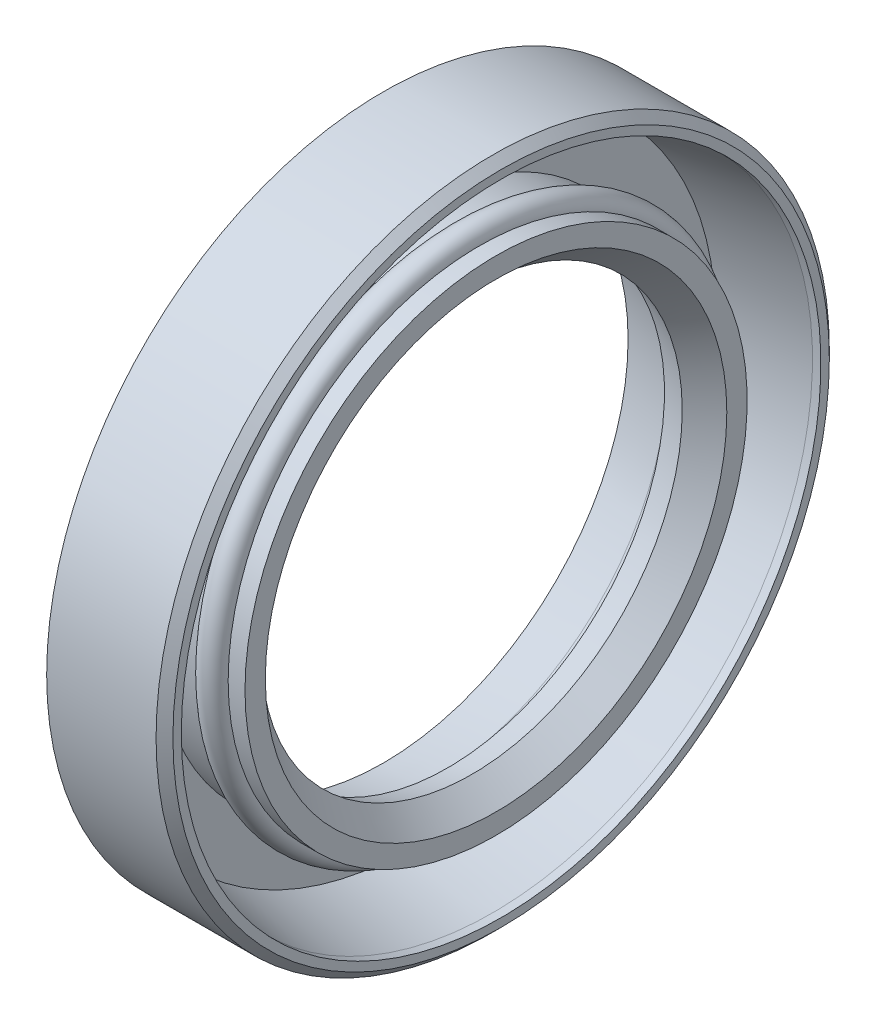
ISO-10303-21;
HEADER;
FILE_DESCRIPTION(('STEP AP214'),'2;1');
FILE_NAME('part.step','',(''),(''),'','','');
FILE_SCHEMA(('AUTOMOTIVE_DESIGN { 1 0 10303 214 1 1 1 1 }'));
ENDSEC;
DATA;
#1=APPLICATION_CONTEXT('core data for automotive mechanical design processes');
#2=APPLICATION_PROTOCOL_DEFINITION('international standard','automotive_design',2000,#1);
#3=PRODUCT_CONTEXT('',#1,'mechanical');
#4=PRODUCT('Part','Part','',(#3));
#5=PRODUCT_RELATED_PRODUCT_CATEGORY('part','',(#4));
#6=PRODUCT_DEFINITION_FORMATION('','',#4);
#7=PRODUCT_DEFINITION_CONTEXT('part definition',#1,'design');
#8=PRODUCT_DEFINITION('design','',#6,#7);
#9=PRODUCT_DEFINITION_SHAPE('','',#8);
#10=(LENGTH_UNIT() NAMED_UNIT(*) SI_UNIT(.MILLI.,.METRE.));
#11=(NAMED_UNIT(*) PLANE_ANGLE_UNIT() SI_UNIT($,.RADIAN.));
#12=(NAMED_UNIT(*) SI_UNIT($,.STERADIAN.) SOLID_ANGLE_UNIT());
#13=UNCERTAINTY_MEASURE_WITH_UNIT(LENGTH_MEASURE(1.E-05),#10,'distance_accuracy_value','');
#14=(GEOMETRIC_REPRESENTATION_CONTEXT(3) GLOBAL_UNCERTAINTY_ASSIGNED_CONTEXT((#13)) GLOBAL_UNIT_ASSIGNED_CONTEXT((#10,
#11,#12)) REPRESENTATION_CONTEXT('',''));
#15=CARTESIAN_POINT('',(0.,0.,0.));
#16=DIRECTION('',(0.,0.,1.));
#17=DIRECTION('',(1.,0.,0.));
#18=AXIS2_PLACEMENT_3D('',#15,#16,#17);
#19=CARTESIAN_POINT('',(6.99999999999999,0.,0.));
#20=DIRECTION('',(-1.,0.,0.));
#21=DIRECTION('',(0.,0.,1.));
#22=AXIS2_PLACEMENT_3D('',#19,#20,#21);
#23=CONICAL_SURFACE('',#22,19.5,0.785398163397449);
#24=CARTESIAN_POINT('',(6.5,0.,0.));
#25=DIRECTION('',(-1.,0.,0.));
#26=DIRECTION('',(0.,0.,1.));
#27=AXIS2_PLACEMENT_3D('',#24,#25,#26);
#28=CIRCLE('',#27,20.);
#29=CARTESIAN_POINT('',(6.5,0.,20.));
#30=VERTEX_POINT('',#29);
#31=EDGE_CURVE('E84',#30,#30,#28,.T.);
#32=ORIENTED_EDGE('',*,*,#31,.F.);
#33=EDGE_LOOP('',(#32));
#34=FACE_BOUND('',#33,.T.);
#35=CARTESIAN_POINT('',(6.99999999999999,0.,0.));
#36=DIRECTION('',(-1.,0.,0.));
#37=DIRECTION('',(0.,0.,1.));
#38=AXIS2_PLACEMENT_3D('',#35,#36,#37);
#39=CIRCLE('',#38,19.5);
#40=CARTESIAN_POINT('',(6.99999999999999,0.,19.5));
#41=VERTEX_POINT('',#40);
#42=EDGE_CURVE('E10',#41,#41,#39,.T.);
#43=ORIENTED_EDGE('',*,*,#42,.T.);
#44=EDGE_LOOP('',(#43));
#45=FACE_BOUND('',#44,.T.);
#46=ADVANCED_FACE('F34',(#34,#45),#23,.T.);
#47=CARTESIAN_POINT('',(6.99999999999999,19.,0.));
#48=DIRECTION('',(-1.,0.,0.));
#49=DIRECTION('',(0.,0.,1.));
#50=AXIS2_PLACEMENT_3D('',#47,#48,#49);
#51=PLANE('',#50);
#52=ORIENTED_EDGE('',*,*,#42,.F.);
#53=EDGE_LOOP('',(#52));
#54=FACE_BOUND('',#53,.T.);
#55=CARTESIAN_POINT('',(6.99999999999999,0.,0.));
#56=DIRECTION('',(-1.,0.,0.));
#57=DIRECTION('',(0.,0.,1.));
#58=AXIS2_PLACEMENT_3D('',#55,#56,#57);
#59=CIRCLE('',#58,19.);
#60=CARTESIAN_POINT('',(6.99999999999999,0.,19.));
#61=VERTEX_POINT('',#60);
#62=EDGE_CURVE('E41',#61,#61,#59,.T.);
#63=ORIENTED_EDGE('',*,*,#62,.T.);
#64=EDGE_LOOP('',(#63));
#65=FACE_BOUND('',#64,.T.);
#66=ADVANCED_FACE('F91',(#54,#65),#51,.F.);
#67=CARTESIAN_POINT('',(0.,0.,0.));
#68=DIRECTION('',(-1.,0.,0.));
#69=DIRECTION('',(0.,0.,1.));
#70=AXIS2_PLACEMENT_3D('',#67,#68,#69);
#71=CYLINDRICAL_SURFACE('',#70,19.);
#72=ORIENTED_EDGE('',*,*,#62,.F.);
#73=EDGE_LOOP('',(#72));
#74=FACE_BOUND('',#73,.T.);
#75=CARTESIAN_POINT('',(6.5,0.,0.));
#76=DIRECTION('',(-1.,0.,0.));
#77=DIRECTION('',(0.,0.,1.));
#78=AXIS2_PLACEMENT_3D('',#75,#76,#77);
#79=CIRCLE('',#78,19.);
#80=CARTESIAN_POINT('',(6.5,0.,19.));
#81=VERTEX_POINT('',#80);
#82=EDGE_CURVE('E45',#81,#81,#79,.T.);
#83=ORIENTED_EDGE('',*,*,#82,.T.);
#84=EDGE_LOOP('',(#83));
#85=FACE_BOUND('',#84,.T.);
#86=ADVANCED_FACE('F95',(#74,#85),#71,.F.);
#87=CARTESIAN_POINT('',(1.6,0.,0.));
#88=DIRECTION('',(1.,0.,0.));
#89=DIRECTION('',(0.,0.,-1.));
#90=AXIS2_PLACEMENT_3D('',#87,#88,#89);
#91=CONICAL_SURFACE('',#90,18.1359977945285,0.17453292519943);
#92=ORIENTED_EDGE('',*,*,#82,.F.);
#93=EDGE_LOOP('',(#92));
#94=FACE_BOUND('',#93,.T.);
#95=CARTESIAN_POINT('',(1.6,0.,0.));
#96=DIRECTION('',(-1.,0.,0.));
#97=DIRECTION('',(0.,0.,1.));
#98=AXIS2_PLACEMENT_3D('',#95,#96,#97);
#99=CIRCLE('',#98,18.1359977945285);
#100=CARTESIAN_POINT('',(1.6,0.,18.1359977945285));
#101=VERTEX_POINT('',#100);
#102=EDGE_CURVE('E49',#101,#101,#99,.T.);
#103=ORIENTED_EDGE('',*,*,#102,.T.);
#104=EDGE_LOOP('',(#103));
#105=FACE_BOUND('',#104,.T.);
#106=ADVANCED_FACE('F100',(#94,#105),#91,.F.);
#107=CARTESIAN_POINT('',(1.6,14.9168282525968,0.));
#108=DIRECTION('',(-1.,0.,0.));
#109=DIRECTION('',(0.,0.,1.));
#110=AXIS2_PLACEMENT_3D('',#107,#108,#109);
#111=PLANE('',#110);
#112=ORIENTED_EDGE('',*,*,#102,.F.);
#113=EDGE_LOOP('',(#112));
#114=FACE_BOUND('',#113,.T.);
#115=CARTESIAN_POINT('',(1.6,0.,0.));
#116=DIRECTION('',(-1.,0.,0.));
#117=DIRECTION('',(0.,0.,1.));
#118=AXIS2_PLACEMENT_3D('',#115,#116,#117);
#119=CIRCLE('',#118,14.9168282525968);
#120=CARTESIAN_POINT('',(1.6,0.,14.9168282525968));
#121=VERTEX_POINT('',#120);
#122=EDGE_CURVE('E54',#121,#121,#119,.T.);
#123=ORIENTED_EDGE('',*,*,#122,.T.);
#124=EDGE_LOOP('',(#123));
#125=FACE_BOUND('',#124,.T.);
#126=ADVANCED_FACE('F106',(#114,#125),#111,.F.);
#127=CARTESIAN_POINT('',(0.,0.,0.));
#128=DIRECTION('',(-1.,0.,0.));
#129=DIRECTION('',(0.,0.,1.));
#130=AXIS2_PLACEMENT_3D('',#127,#128,#129);
#131=CYLINDRICAL_SURFACE('',#130,14.9168282525968);
#132=ORIENTED_EDGE('',*,*,#122,.F.);
#133=EDGE_LOOP('',(#132));
#134=FACE_BOUND('',#133,.T.);
#135=CARTESIAN_POINT('',(4.1,0.,0.));
#136=DIRECTION('',(-1.,0.,0.));
#137=DIRECTION('',(0.,0.,1.));
#138=AXIS2_PLACEMENT_3D('',#135,#136,#137);
#139=CIRCLE('',#138,14.9168282525968);
#140=CARTESIAN_POINT('',(4.1,0.,14.9168282525968));
#141=VERTEX_POINT('',#140);
#142=EDGE_CURVE('E57',#141,#141,#139,.T.);
#143=ORIENTED_EDGE('',*,*,#142,.T.);
#144=EDGE_LOOP('',(#143));
#145=FACE_BOUND('',#144,.T.);
#146=ADVANCED_FACE('F110',(#134,#145),#131,.T.);
#147=CARTESIAN_POINT('',(4.9,0.,0.));
#148=DIRECTION('',(-1.,0.,0.));
#149=DIRECTION('',(0.,0.,1.));
#150=AXIS2_PLACEMENT_3D('',#147,#148,#149);
#151=TOROIDAL_SURFACE('',#150,14.9168282525968,0.8);
#152=ORIENTED_EDGE('',*,*,#142,.F.);
#153=EDGE_LOOP('',(#152));
#154=FACE_BOUND('',#153,.T.);
#155=CARTESIAN_POINT('',(5.7,0.,0.));
#156=DIRECTION('',(-1.,0.,0.));
#157=DIRECTION('',(0.,0.,1.));
#158=AXIS2_PLACEMENT_3D('',#155,#156,#157);
#159=CIRCLE('',#158,14.9168282525968);
#160=CARTESIAN_POINT('',(5.7,0.,14.9168282525968));
#161=VERTEX_POINT('',#160);
#162=EDGE_CURVE('E60',#161,#161,#159,.T.);
#163=ORIENTED_EDGE('',*,*,#162,.T.);
#164=EDGE_LOOP('',(#163));
#165=FACE_BOUND('',#164,.T.);
#166=ADVANCED_FACE('F114',(#154,#165),#151,.T.);
#167=CARTESIAN_POINT('',(0.,0.,0.));
#168=DIRECTION('',(-1.,0.,0.));
#169=DIRECTION('',(0.,0.,1.));
#170=AXIS2_PLACEMENT_3D('',#167,#168,#169);
#171=CYLINDRICAL_SURFACE('',#170,14.9168282525968);
#172=ORIENTED_EDGE('',*,*,#162,.F.);
#173=EDGE_LOOP('',(#172));
#174=FACE_BOUND('',#173,.T.);
#175=CARTESIAN_POINT('',(6.7,0.,0.));
#176=DIRECTION('',(-1.,0.,0.));
#177=DIRECTION('',(0.,0.,1.));
#178=AXIS2_PLACEMENT_3D('',#175,#176,#177);
#179=CIRCLE('',#178,14.9168282525968);
#180=CARTESIAN_POINT('',(6.7,0.,14.9168282525968));
#181=VERTEX_POINT('',#180);
#182=EDGE_CURVE('E63',#181,#181,#179,.T.);
#183=ORIENTED_EDGE('',*,*,#182,.T.);
#184=EDGE_LOOP('',(#183));
#185=FACE_BOUND('',#184,.T.);
#186=ADVANCED_FACE('F118',(#174,#185),#171,.T.);
#187=CARTESIAN_POINT('',(6.7,13.7084141262984,0.));
#188=DIRECTION('',(-1.,0.,0.));
#189=DIRECTION('',(0.,0.,1.));
#190=AXIS2_PLACEMENT_3D('',#187,#188,#189);
#191=PLANE('',#190);
#192=ORIENTED_EDGE('',*,*,#182,.F.);
#193=EDGE_LOOP('',(#192));
#194=FACE_BOUND('',#193,.T.);
#195=CARTESIAN_POINT('',(6.7,0.,0.));
#196=DIRECTION('',(-1.,0.,0.));
#197=DIRECTION('',(0.,0.,1.));
#198=AXIS2_PLACEMENT_3D('',#195,#196,#197);
#199=CIRCLE('',#198,13.7084141262984);
#200=CARTESIAN_POINT('',(6.7,0.,13.7084141262984));
#201=VERTEX_POINT('',#200);
#202=EDGE_CURVE('E66',#201,#201,#199,.T.);
#203=ORIENTED_EDGE('',*,*,#202,.T.);
#204=EDGE_LOOP('',(#203));
#205=FACE_BOUND('',#204,.T.);
#206=ADVANCED_FACE('F122',(#194,#205),#191,.F.);
#207=CARTESIAN_POINT('',(5.25986812364231,0.,0.));
#208=DIRECTION('',(1.,0.,0.));
#209=DIRECTION('',(0.,0.,-1.));
#210=AXIS2_PLACEMENT_3D('',#207,#208,#209);
#211=CONICAL_SURFACE('',#210,12.5,0.698131700797732);
#212=ORIENTED_EDGE('',*,*,#202,.F.);
#213=EDGE_LOOP('',(#212));
#214=FACE_BOUND('',#213,.T.);
#215=CARTESIAN_POINT('',(5.25986812364231,0.,0.));
#216=DIRECTION('',(-1.,0.,0.));
#217=DIRECTION('',(0.,0.,1.));
#218=AXIS2_PLACEMENT_3D('',#215,#216,#217);
#219=CIRCLE('',#218,12.5);
#220=CARTESIAN_POINT('',(5.25986812364231,0.,12.5));
#221=VERTEX_POINT('',#220);
#222=EDGE_CURVE('E69',#221,#221,#219,.T.);
#223=ORIENTED_EDGE('',*,*,#222,.T.);
#224=EDGE_LOOP('',(#223));
#225=FACE_BOUND('',#224,.T.);
#226=ADVANCED_FACE('F126',(#214,#225),#211,.F.);
#227=CARTESIAN_POINT('',(3.81973624728463,0.,0.));
#228=DIRECTION('',(-1.,0.,0.));
#229=DIRECTION('',(0.,0.,1.));
#230=AXIS2_PLACEMENT_3D('',#227,#228,#229);
#231=CONICAL_SURFACE('',#230,12.8858821732644,0.261799387799149);
#232=ORIENTED_EDGE('',*,*,#222,.F.);
#233=EDGE_LOOP('',(#232));
#234=FACE_BOUND('',#233,.T.);
#235=CARTESIAN_POINT('',(3.81973624728463,0.,0.));
#236=DIRECTION('',(-1.,0.,0.));
#237=DIRECTION('',(0.,0.,1.));
#238=AXIS2_PLACEMENT_3D('',#235,#236,#237);
#239=CIRCLE('',#238,12.8858821732644);
#240=CARTESIAN_POINT('',(3.81973624728463,0.,12.8858821732644));
#241=VERTEX_POINT('',#240);
#242=EDGE_CURVE('E72',#241,#241,#239,.T.);
#243=ORIENTED_EDGE('',*,*,#242,.T.);
#244=EDGE_LOOP('',(#243));
#245=FACE_BOUND('',#244,.T.);
#246=ADVANCED_FACE('F130',(#234,#245),#231,.F.);
#247=CARTESIAN_POINT('',(2.6462212612019,0.,0.));
#248=DIRECTION('',(-1.,0.,0.));
#249=DIRECTION('',(0.,0.,1.));
#250=AXIS2_PLACEMENT_3D('',#247,#248,#249);
#251=TOROIDAL_SURFACE('',#250,12.8858821732644,1.17351498608272);
#252=ORIENTED_EDGE('',*,*,#242,.F.);
#253=EDGE_LOOP('',(#252));
#254=FACE_BOUND('',#253,.T.);
#255=CARTESIAN_POINT('',(2.85,0.,0.));
#256=DIRECTION('',(-1.,0.,0.));
#257=DIRECTION('',(0.,0.,1.));
#258=AXIS2_PLACEMENT_3D('',#255,#256,#257);
#259=CIRCLE('',#258,14.0415688298346);
#260=CARTESIAN_POINT('',(2.85,0.,14.0415688298346));
#261=VERTEX_POINT('',#260);
#262=EDGE_CURVE('E75',#261,#261,#259,.T.);
#263=ORIENTED_EDGE('',*,*,#262,.T.);
#264=EDGE_LOOP('',(#263));
#265=FACE_BOUND('',#264,.T.);
#266=ADVANCED_FACE('F134',(#254,#265),#251,.F.);
#267=CARTESIAN_POINT('',(0.,0.,0.));
#268=DIRECTION('',(-1.,0.,0.));
#269=DIRECTION('',(0.,0.,1.));
#270=AXIS2_PLACEMENT_3D('',#267,#268,#269);
#271=CONICAL_SURFACE('',#270,14.5441007248538,0.17453292519943);
#272=ORIENTED_EDGE('',*,*,#262,.F.);
#273=EDGE_LOOP('',(#272));
#274=FACE_BOUND('',#273,.T.);
#275=CARTESIAN_POINT('',(0.,0.,0.));
#276=DIRECTION('',(-1.,0.,0.));
#277=DIRECTION('',(0.,0.,1.));
#278=AXIS2_PLACEMENT_3D('',#275,#276,#277);
#279=CIRCLE('',#278,14.5441007248538);
#280=CARTESIAN_POINT('',(0.,0.,14.5441007248538));
#281=VERTEX_POINT('',#280);
#282=EDGE_CURVE('E78',#281,#281,#279,.T.);
#283=ORIENTED_EDGE('',*,*,#282,.T.);
#284=EDGE_LOOP('',(#283));
#285=FACE_BOUND('',#284,.T.);
#286=ADVANCED_FACE('F138',(#274,#285),#271,.F.);
#287=CARTESIAN_POINT('',(0.,20.,0.));
#288=DIRECTION('',(1.,0.,0.));
#289=DIRECTION('',(0.,0.,-1.));
#290=AXIS2_PLACEMENT_3D('',#287,#288,#289);
#291=PLANE('',#290);
#292=ORIENTED_EDGE('',*,*,#282,.F.);
#293=EDGE_LOOP('',(#292));
#294=FACE_BOUND('',#293,.T.);
#295=CARTESIAN_POINT('',(0.,0.,0.));
#296=DIRECTION('',(-1.,0.,0.));
#297=DIRECTION('',(0.,0.,1.));
#298=AXIS2_PLACEMENT_3D('',#295,#296,#297);
#299=CIRCLE('',#298,20.);
#300=CARTESIAN_POINT('',(0.,0.,20.));
#301=VERTEX_POINT('',#300);
#302=EDGE_CURVE('E81',#301,#301,#299,.T.);
#303=ORIENTED_EDGE('',*,*,#302,.T.);
#304=EDGE_LOOP('',(#303));
#305=FACE_BOUND('',#304,.T.);
#306=ADVANCED_FACE('F142',(#294,#305),#291,.F.);
#307=CARTESIAN_POINT('',(0.,0.,0.));
#308=DIRECTION('',(-1.,0.,0.));
#309=DIRECTION('',(0.,0.,1.));
#310=AXIS2_PLACEMENT_3D('',#307,#308,#309);
#311=CYLINDRICAL_SURFACE('',#310,20.);
#312=ORIENTED_EDGE('',*,*,#302,.F.);
#313=EDGE_LOOP('',(#312));
#314=FACE_BOUND('',#313,.T.);
#315=ORIENTED_EDGE('',*,*,#31,.T.);
#316=EDGE_LOOP('',(#315));
#317=FACE_BOUND('',#316,.T.);
#318=ADVANCED_FACE('F88',(#314,#317),#311,.T.);
#319=CLOSED_SHELL('',(#46,#66,#86,#106,#126,#146,#166,#186,#206,#226,#246,#266,#286,#306,#318));
#320=CARTESIAN_POINT('',(4.9,0.,0.));
#321=DIRECTION('',(-1.,0.,0.));
#322=DIRECTION('',(0.,0.,1.));
#323=AXIS2_PLACEMENT_3D('',#320,#321,#322);
#324=TOROIDAL_SURFACE('',#323,14.9168282525968,0.5);
#325=CARTESIAN_POINT('',(4.9,0.,15.4168282525968));
#326=VERTEX_POINT('',#325);
#327=VERTEX_LOOP('',#326);
#328=FACE_BOUND('',#327,.T.);
#329=ADVANCED_FACE('F150',(#328),#324,.F.);
#330=CLOSED_SHELL('',(#329));
#331=ORIENTED_CLOSED_SHELL('',*,#330,.T.);
#332=BREP_WITH_VOIDS('B2',#319,(#331));
#333=ADVANCED_BREP_SHAPE_REPRESENTATION('',(#18,#332),#14);
#334=SHAPE_DEFINITION_REPRESENTATION(#9,#333);
ENDSEC;
END-ISO-10303-21;
